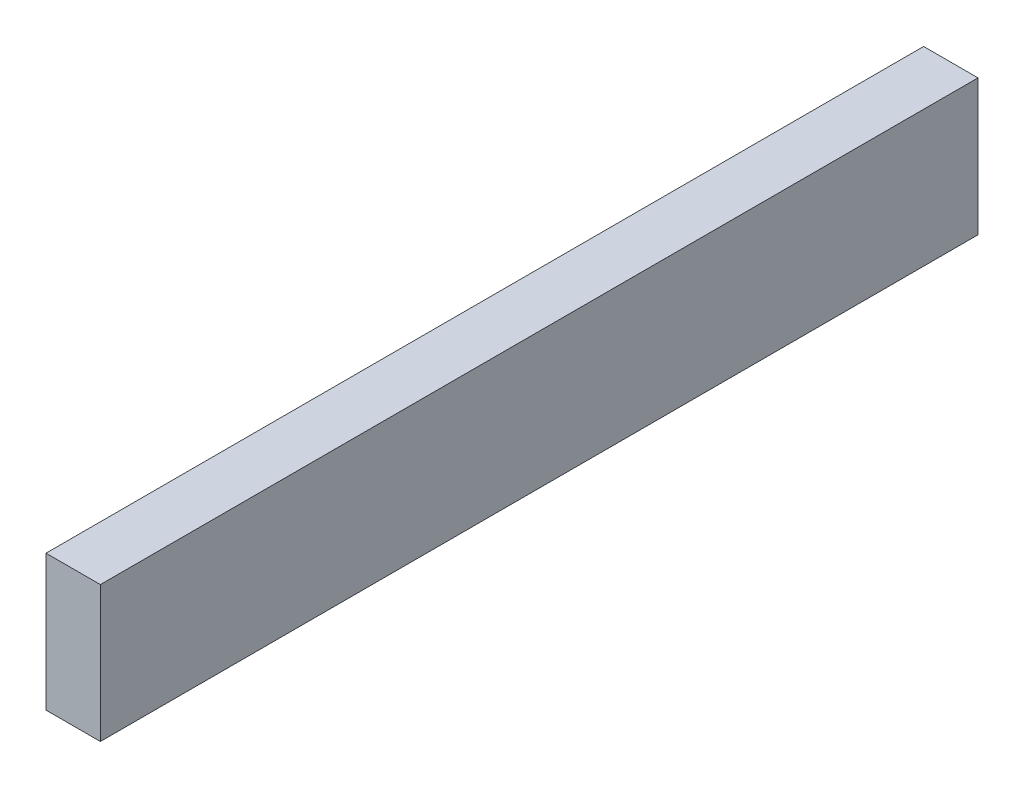
ISO-10303-21;
HEADER;
FILE_DESCRIPTION(('STEP AP214'),'2;1');
FILE_NAME('part.step','',(''),(''),'','','');
FILE_SCHEMA(('AUTOMOTIVE_DESIGN { 1 0 10303 214 1 1 1 1 }'));
ENDSEC;
DATA;
#1=APPLICATION_CONTEXT('core data for automotive mechanical design processes');
#2=APPLICATION_PROTOCOL_DEFINITION('international standard','automotive_design',2000,#1);
#3=PRODUCT_CONTEXT('',#1,'mechanical');
#4=PRODUCT('Part','Part','',(#3));
#5=PRODUCT_RELATED_PRODUCT_CATEGORY('part','',(#4));
#6=PRODUCT_DEFINITION_FORMATION('','',#4);
#7=PRODUCT_DEFINITION_CONTEXT('part definition',#1,'design');
#8=PRODUCT_DEFINITION('design','',#6,#7);
#9=PRODUCT_DEFINITION_SHAPE('','',#8);
#10=(LENGTH_UNIT() NAMED_UNIT(*) SI_UNIT(.MILLI.,.METRE.));
#11=(NAMED_UNIT(*) PLANE_ANGLE_UNIT() SI_UNIT($,.RADIAN.));
#12=(NAMED_UNIT(*) SI_UNIT($,.STERADIAN.) SOLID_ANGLE_UNIT());
#13=UNCERTAINTY_MEASURE_WITH_UNIT(LENGTH_MEASURE(1.E-05),#10,'distance_accuracy_value','');
#14=(GEOMETRIC_REPRESENTATION_CONTEXT(3) GLOBAL_UNCERTAINTY_ASSIGNED_CONTEXT((#13)) GLOBAL_UNIT_ASSIGNED_CONTEXT((#10,
#11,#12)) REPRESENTATION_CONTEXT('',''));
#15=CARTESIAN_POINT('',(0.,0.,0.));
#16=DIRECTION('',(0.,0.,1.));
#17=DIRECTION('',(1.,0.,0.));
#18=AXIS2_PLACEMENT_3D('',#15,#16,#17);
#19=CARTESIAN_POINT('',(0.,0.,820.));
#20=DIRECTION('',(1.,0.,0.));
#21=DIRECTION('',(0.,0.,-1.));
#22=AXIS2_PLACEMENT_3D('',#19,#20,#21);
#23=PLANE('',#22);
#24=DIRECTION('',(0.,-1.,0.));
#25=VECTOR('',#24,1.);
#26=CARTESIAN_POINT('',(0.,0.,0.));
#27=LINE('',#26,#25);
#28=CARTESIAN_POINT('',(0.,127.,0.));
#29=VERTEX_POINT('',#28);
#30=CARTESIAN_POINT('',(0.,0.,0.));
#31=VERTEX_POINT('',#30);
#32=EDGE_CURVE('E97',#29,#31,#27,.T.);
#33=ORIENTED_EDGE('',*,*,#32,.T.);
#34=DIRECTION('',(0.,0.,-1.));
#35=VECTOR('',#34,1.);
#36=CARTESIAN_POINT('',(0.,0.,820.));
#37=LINE('',#36,#35);
#38=CARTESIAN_POINT('',(0.,0.,820.));
#39=VERTEX_POINT('',#38);
#40=EDGE_CURVE('E11',#39,#31,#37,.T.);
#41=ORIENTED_EDGE('',*,*,#40,.F.);
#42=DIRECTION('',(0.,-1.,0.));
#43=VECTOR('',#42,1.);
#44=CARTESIAN_POINT('',(0.,0.,820.));
#45=LINE('',#44,#43);
#46=CARTESIAN_POINT('',(0.,127.,820.));
#47=VERTEX_POINT('',#46);
#48=EDGE_CURVE('E85',#47,#39,#45,.T.);
#49=ORIENTED_EDGE('',*,*,#48,.F.);
#50=DIRECTION('',(0.,0.,-1.));
#51=VECTOR('',#50,1.);
#52=CARTESIAN_POINT('',(0.,127.,820.));
#53=LINE('',#52,#51);
#54=EDGE_CURVE('E93',#47,#29,#53,.T.);
#55=ORIENTED_EDGE('',*,*,#54,.T.);
#56=EDGE_LOOP('',(#33,#41,#49,#55));
#57=FACE_BOUND('',#56,.T.);
#58=ADVANCED_FACE('F34',(#57),#23,.F.);
#59=CARTESIAN_POINT('',(0.,0.,820.));
#60=DIRECTION('',(0.,1.,0.));
#61=DIRECTION('',(0.,0.,1.));
#62=AXIS2_PLACEMENT_3D('',#59,#60,#61);
#63=PLANE('',#62);
#64=DIRECTION('',(1.,0.,0.));
#65=VECTOR('',#64,1.);
#66=CARTESIAN_POINT('',(0.,0.,0.));
#67=LINE('',#66,#65);
#68=CARTESIAN_POINT('',(50.8,0.,0.));
#69=VERTEX_POINT('',#68);
#70=EDGE_CURVE('E89',#31,#69,#67,.T.);
#71=ORIENTED_EDGE('',*,*,#70,.T.);
#72=DIRECTION('',(0.,0.,-1.));
#73=VECTOR('',#72,1.);
#74=CARTESIAN_POINT('',(50.8,0.,820.));
#75=LINE('',#74,#73);
#76=CARTESIAN_POINT('',(50.8,0.,820.));
#77=VERTEX_POINT('',#76);
#78=EDGE_CURVE('E42',#77,#69,#75,.T.);
#79=ORIENTED_EDGE('',*,*,#78,.F.);
#80=DIRECTION('',(1.,0.,0.));
#81=VECTOR('',#80,1.);
#82=CARTESIAN_POINT('',(0.,0.,820.));
#83=LINE('',#82,#81);
#84=EDGE_CURVE('E80',#39,#77,#83,.T.);
#85=ORIENTED_EDGE('',*,*,#84,.F.);
#86=ORIENTED_EDGE('',*,*,#40,.T.);
#87=EDGE_LOOP('',(#71,#79,#85,#86));
#88=FACE_BOUND('',#87,.T.);
#89=ADVANCED_FACE('F88',(#88),#63,.F.);
#90=CARTESIAN_POINT('',(50.8,0.,820.));
#91=DIRECTION('',(-1.,0.,0.));
#92=DIRECTION('',(0.,0.,1.));
#93=AXIS2_PLACEMENT_3D('',#90,#91,#92);
#94=PLANE('',#93);
#95=DIRECTION('',(0.,1.,0.));
#96=VECTOR('',#95,1.);
#97=CARTESIAN_POINT('',(50.8,0.,0.));
#98=LINE('',#97,#96);
#99=CARTESIAN_POINT('',(50.8,127.,0.));
#100=VERTEX_POINT('',#99);
#101=EDGE_CURVE('E67',#69,#100,#98,.T.);
#102=ORIENTED_EDGE('',*,*,#101,.T.);
#103=DIRECTION('',(0.,0.,-1.));
#104=VECTOR('',#103,1.);
#105=CARTESIAN_POINT('',(50.8,127.,820.));
#106=LINE('',#105,#104);
#107=CARTESIAN_POINT('',(50.8,127.,820.));
#108=VERTEX_POINT('',#107);
#109=EDGE_CURVE('E90',#108,#100,#106,.T.);
#110=ORIENTED_EDGE('',*,*,#109,.F.);
#111=DIRECTION('',(0.,1.,0.));
#112=VECTOR('',#111,1.);
#113=CARTESIAN_POINT('',(50.8,0.,820.));
#114=LINE('',#113,#112);
#115=EDGE_CURVE('E83',#77,#108,#114,.T.);
#116=ORIENTED_EDGE('',*,*,#115,.F.);
#117=ORIENTED_EDGE('',*,*,#78,.T.);
#118=EDGE_LOOP('',(#102,#110,#116,#117));
#119=FACE_BOUND('',#118,.T.);
#120=ADVANCED_FACE('F91',(#119),#94,.F.);
#121=CARTESIAN_POINT('',(0.,127.,820.));
#122=DIRECTION('',(0.,-1.,0.));
#123=DIRECTION('',(0.,0.,-1.));
#124=AXIS2_PLACEMENT_3D('',#121,#122,#123);
#125=PLANE('',#124);
#126=DIRECTION('',(-1.,0.,0.));
#127=VECTOR('',#126,1.);
#128=CARTESIAN_POINT('',(0.,127.,0.));
#129=LINE('',#128,#127);
#130=EDGE_CURVE('E73',#100,#29,#129,.T.);
#131=ORIENTED_EDGE('',*,*,#130,.T.);
#132=ORIENTED_EDGE('',*,*,#54,.F.);
#133=DIRECTION('',(-1.,0.,0.));
#134=VECTOR('',#133,1.);
#135=CARTESIAN_POINT('',(0.,127.,820.));
#136=LINE('',#135,#134);
#137=EDGE_CURVE('E50',#108,#47,#136,.T.);
#138=ORIENTED_EDGE('',*,*,#137,.F.);
#139=ORIENTED_EDGE('',*,*,#109,.T.);
#140=EDGE_LOOP('',(#131,#132,#138,#139));
#141=FACE_BOUND('',#140,.T.);
#142=ADVANCED_FACE('F104',(#141),#125,.F.);
#143=CARTESIAN_POINT('',(0.,0.,820.));
#144=DIRECTION('',(0.,0.,-1.));
#145=DIRECTION('',(-1.,0.,0.));
#146=AXIS2_PLACEMENT_3D('',#143,#144,#145);
#147=PLANE('',#146);
#148=ORIENTED_EDGE('',*,*,#48,.T.);
#149=ORIENTED_EDGE('',*,*,#84,.T.);
#150=ORIENTED_EDGE('',*,*,#115,.T.);
#151=ORIENTED_EDGE('',*,*,#137,.T.);
#152=EDGE_LOOP('',(#148,#149,#150,#151));
#153=FACE_BOUND('',#152,.T.);
#154=ADVANCED_FACE('F81',(#153),#147,.F.);
#155=CARTESIAN_POINT('',(0.,0.,0.));
#156=DIRECTION('',(0.,0.,-1.));
#157=DIRECTION('',(-1.,0.,0.));
#158=AXIS2_PLACEMENT_3D('',#155,#156,#157);
#159=PLANE('',#158);
#160=ORIENTED_EDGE('',*,*,#32,.F.);
#161=ORIENTED_EDGE('',*,*,#130,.F.);
#162=ORIENTED_EDGE('',*,*,#101,.F.);
#163=ORIENTED_EDGE('',*,*,#70,.F.);
#164=EDGE_LOOP('',(#160,#161,#162,#163));
#165=FACE_BOUND('',#164,.T.);
#166=ADVANCED_FACE('F107',(#165),#159,.T.);
#167=CLOSED_SHELL('',(#58,#89,#120,#142,#154,#166));
#168=MANIFOLD_SOLID_BREP('B2',#167);
#169=ADVANCED_BREP_SHAPE_REPRESENTATION('',(#18,#168),#14);
#170=SHAPE_DEFINITION_REPRESENTATION(#9,#169);
ENDSEC;
END-ISO-10303-21;
